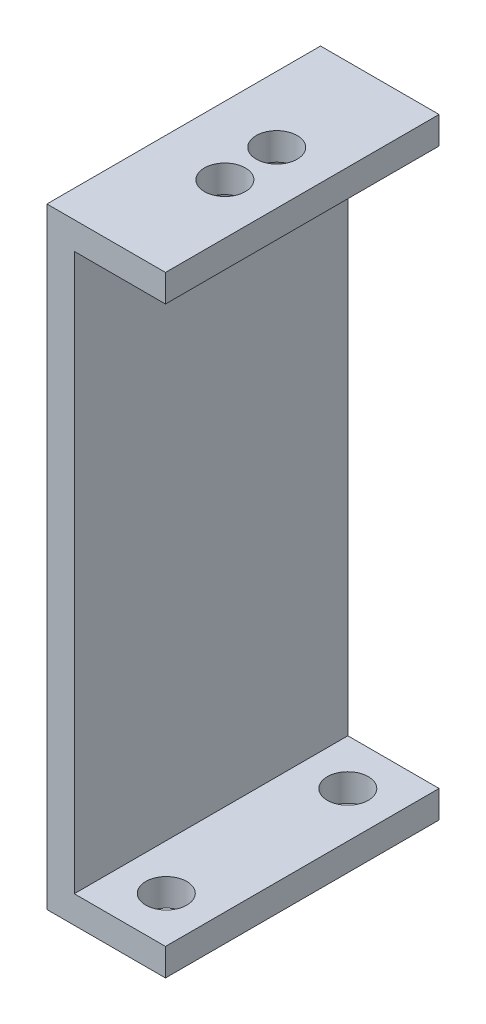
ISO-10303-21;
HEADER;
FILE_DESCRIPTION(('STEP AP214'),'2;1');
FILE_NAME('part.step','',(''),(''),'','','');
FILE_SCHEMA(('AUTOMOTIVE_DESIGN { 1 0 10303 214 1 1 1 1 }'));
ENDSEC;
DATA;
#1=APPLICATION_CONTEXT('core data for automotive mechanical design processes');
#2=APPLICATION_PROTOCOL_DEFINITION('international standard','automotive_design',2000,#1);
#3=PRODUCT_CONTEXT('',#1,'mechanical');
#4=PRODUCT('Part','Part','',(#3));
#5=PRODUCT_RELATED_PRODUCT_CATEGORY('part','',(#4));
#6=PRODUCT_DEFINITION_FORMATION('','',#4);
#7=PRODUCT_DEFINITION_CONTEXT('part definition',#1,'design');
#8=PRODUCT_DEFINITION('design','',#6,#7);
#9=PRODUCT_DEFINITION_SHAPE('','',#8);
#10=(LENGTH_UNIT() NAMED_UNIT(*) SI_UNIT(.MILLI.,.METRE.));
#11=(NAMED_UNIT(*) PLANE_ANGLE_UNIT() SI_UNIT($,.RADIAN.));
#12=(NAMED_UNIT(*) SI_UNIT($,.STERADIAN.) SOLID_ANGLE_UNIT());
#13=UNCERTAINTY_MEASURE_WITH_UNIT(LENGTH_MEASURE(1.E-05),#10,'distance_accuracy_value','');
#14=(GEOMETRIC_REPRESENTATION_CONTEXT(3) GLOBAL_UNCERTAINTY_ASSIGNED_CONTEXT((#13)) GLOBAL_UNIT_ASSIGNED_CONTEXT((#10,
#11,#12)) REPRESENTATION_CONTEXT('',''));
#15=CARTESIAN_POINT('',(0.,0.,0.));
#16=DIRECTION('',(0.,0.,1.));
#17=DIRECTION('',(1.,0.,0.));
#18=AXIS2_PLACEMENT_3D('',#15,#16,#17);
#19=CARTESIAN_POINT('',(6.5,-33.5,30.));
#20=DIRECTION('',(-1.,0.,0.));
#21=DIRECTION('',(0.,0.,1.));
#22=AXIS2_PLACEMENT_3D('',#19,#20,#21);
#23=PLANE('',#22);
#24=DIRECTION('',(0.,1.,0.));
#25=VECTOR('',#24,1.);
#26=CARTESIAN_POINT('',(6.5,-33.5,0.));
#27=LINE('',#26,#25);
#28=CARTESIAN_POINT('',(6.5,-33.5,0.));
#29=VERTEX_POINT('',#28);
#30=CARTESIAN_POINT('',(6.5,-30.5,0.));
#31=VERTEX_POINT('',#30);
#32=EDGE_CURVE('E120',#29,#31,#27,.T.);
#33=ORIENTED_EDGE('',*,*,#32,.T.);
#34=DIRECTION('',(0.,0.,-1.));
#35=VECTOR('',#34,1.);
#36=CARTESIAN_POINT('',(6.5,-30.5,45.3512882876339));
#37=LINE('',#36,#35);
#38=CARTESIAN_POINT('',(6.5,-30.5,30.));
#39=VERTEX_POINT('',#38);
#40=EDGE_CURVE('E109',#39,#31,#37,.T.);
#41=ORIENTED_EDGE('',*,*,#40,.F.);
#42=DIRECTION('',(0.,1.,0.));
#43=VECTOR('',#42,1.);
#44=CARTESIAN_POINT('',(6.5,-33.5,30.));
#45=LINE('',#44,#43);
#46=CARTESIAN_POINT('',(6.5,-33.5,30.));
#47=VERTEX_POINT('',#46);
#48=EDGE_CURVE('E118',#47,#39,#45,.T.);
#49=ORIENTED_EDGE('',*,*,#48,.F.);
#50=DIRECTION('',(0.,0.,-1.));
#51=VECTOR('',#50,1.);
#52=CARTESIAN_POINT('',(6.5,-33.5,30.));
#53=LINE('',#52,#51);
#54=EDGE_CURVE('E133',#47,#29,#53,.T.);
#55=ORIENTED_EDGE('',*,*,#54,.T.);
#56=EDGE_LOOP('',(#33,#41,#49,#55));
#57=FACE_BOUND('',#56,.T.);
#58=ADVANCED_FACE('F33',(#57),#23,.F.);
#59=CARTESIAN_POINT('',(6.5,30.5,30.));
#60=VERTEX_POINT('',#59);
#61=CARTESIAN_POINT('',(6.5,33.5,30.));
#62=VERTEX_POINT('',#61);
#63=EDGE_CURVE('E84',#60,#62,#45,.T.);
#64=ORIENTED_EDGE('',*,*,#63,.F.);
#65=DIRECTION('',(0.,0.,1.));
#66=VECTOR('',#65,1.);
#67=CARTESIAN_POINT('',(6.5,30.5,-22.1051576879177));
#68=LINE('',#67,#66);
#69=CARTESIAN_POINT('',(6.5,30.5,0.));
#70=VERTEX_POINT('',#69);
#71=EDGE_CURVE('E121',#70,#60,#68,.T.);
#72=ORIENTED_EDGE('',*,*,#71,.F.);
#73=CARTESIAN_POINT('',(6.5,33.5,0.));
#74=VERTEX_POINT('',#73);
#75=EDGE_CURVE('E112',#70,#74,#27,.T.);
#76=ORIENTED_EDGE('',*,*,#75,.T.);
#77=DIRECTION('',(0.,0.,-1.));
#78=VECTOR('',#77,1.);
#79=CARTESIAN_POINT('',(6.5,33.5,30.));
#80=LINE('',#79,#78);
#81=EDGE_CURVE('E146',#62,#74,#80,.T.);
#82=ORIENTED_EDGE('',*,*,#81,.F.);
#83=EDGE_LOOP('',(#64,#72,#76,#82));
#84=FACE_BOUND('',#83,.T.);
#85=ADVANCED_FACE('F35',(#84),#23,.F.);
#86=CARTESIAN_POINT('',(-6.5,33.5,30.));
#87=DIRECTION('',(0.,-1.,0.));
#88=DIRECTION('',(0.,0.,-1.));
#89=AXIS2_PLACEMENT_3D('',#86,#87,#88);
#90=PLANE('',#89);
#91=CARTESIAN_POINT('',(0.958202428755328,33.5,17.9446950770199));
#92=DIRECTION('',(0.,1.,0.));
#93=DIRECTION('',(0.,0.,1.));
#94=AXIS2_PLACEMENT_3D('',#91,#92,#93);
#95=CIRCLE('',#94,2.24999999999999);
#96=CARTESIAN_POINT('',(0.958202428755328,33.5,20.1946950770199));
#97=VERTEX_POINT('',#96);
#98=EDGE_CURVE('E200',#97,#97,#95,.T.);
#99=ORIENTED_EDGE('',*,*,#98,.F.);
#100=EDGE_LOOP('',(#99));
#101=FACE_BOUND('',#100,.T.);
#102=CARTESIAN_POINT('',(0.724225784551891,33.5,12.0242730008044));
#103=DIRECTION('',(0.,1.,0.));
#104=DIRECTION('',(0.,0.,1.));
#105=AXIS2_PLACEMENT_3D('',#102,#103,#104);
#106=CIRCLE('',#105,2.25);
#107=CARTESIAN_POINT('',(0.724225784551891,33.5,14.2742730008044));
#108=VERTEX_POINT('',#107);
#109=EDGE_CURVE('E182',#108,#108,#106,.T.);
#110=ORIENTED_EDGE('',*,*,#109,.F.);
#111=EDGE_LOOP('',(#110));
#112=FACE_BOUND('',#111,.T.);
#113=DIRECTION('',(-1.,0.,0.));
#114=VECTOR('',#113,1.);
#115=CARTESIAN_POINT('',(-6.5,33.5,0.));
#116=LINE('',#115,#114);
#117=CARTESIAN_POINT('',(-6.5,33.5,0.));
#118=VERTEX_POINT('',#117);
#119=EDGE_CURVE('E135',#74,#118,#116,.T.);
#120=ORIENTED_EDGE('',*,*,#119,.T.);
#121=DIRECTION('',(0.,0.,-1.));
#122=VECTOR('',#121,1.);
#123=CARTESIAN_POINT('',(-6.5,33.5,30.));
#124=LINE('',#123,#122);
#125=CARTESIAN_POINT('',(-6.5,33.5,30.));
#126=VERTEX_POINT('',#125);
#127=EDGE_CURVE('E143',#126,#118,#124,.T.);
#128=ORIENTED_EDGE('',*,*,#127,.F.);
#129=DIRECTION('',(-1.,0.,0.));
#130=VECTOR('',#129,1.);
#131=CARTESIAN_POINT('',(-6.5,33.5,30.));
#132=LINE('',#131,#130);
#133=EDGE_CURVE('E125',#62,#126,#132,.T.);
#134=ORIENTED_EDGE('',*,*,#133,.F.);
#135=ORIENTED_EDGE('',*,*,#81,.T.);
#136=EDGE_LOOP('',(#120,#128,#134,#135));
#137=FACE_BOUND('',#136,.T.);
#138=ADVANCED_FACE('F168',(#101,#112,#137),#90,.F.);
#139=CARTESIAN_POINT('',(-6.5,-33.5,30.));
#140=DIRECTION('',(1.,0.,0.));
#141=DIRECTION('',(0.,0.,-1.));
#142=AXIS2_PLACEMENT_3D('',#139,#140,#141);
#143=PLANE('',#142);
#144=DIRECTION('',(0.,-1.,0.));
#145=VECTOR('',#144,1.);
#146=CARTESIAN_POINT('',(-6.5,-33.5,0.));
#147=LINE('',#146,#145);
#148=CARTESIAN_POINT('',(-6.5,-33.5,0.));
#149=VERTEX_POINT('',#148);
#150=EDGE_CURVE('E137',#118,#149,#147,.T.);
#151=ORIENTED_EDGE('',*,*,#150,.T.);
#152=DIRECTION('',(0.,0.,-1.));
#153=VECTOR('',#152,1.);
#154=CARTESIAN_POINT('',(-6.5,-33.5,30.));
#155=LINE('',#154,#153);
#156=CARTESIAN_POINT('',(-6.5,-33.5,30.));
#157=VERTEX_POINT('',#156);
#158=EDGE_CURVE('E141',#157,#149,#155,.T.);
#159=ORIENTED_EDGE('',*,*,#158,.F.);
#160=DIRECTION('',(0.,-1.,0.));
#161=VECTOR('',#160,1.);
#162=CARTESIAN_POINT('',(-6.5,-33.5,30.));
#163=LINE('',#162,#161);
#164=EDGE_CURVE('E127',#126,#157,#163,.T.);
#165=ORIENTED_EDGE('',*,*,#164,.F.);
#166=ORIENTED_EDGE('',*,*,#127,.T.);
#167=EDGE_LOOP('',(#151,#159,#165,#166));
#168=FACE_BOUND('',#167,.T.);
#169=ADVANCED_FACE('F172',(#168),#143,.F.);
#170=CARTESIAN_POINT('',(-6.5,-33.5,30.));
#171=DIRECTION('',(0.,1.,0.));
#172=DIRECTION('',(0.,0.,1.));
#173=AXIS2_PLACEMENT_3D('',#170,#171,#172);
#174=PLANE('',#173);
#175=CARTESIAN_POINT('',(1.5,-33.5,5.00801519830674));
#176=DIRECTION('',(0.,1.,0.));
#177=DIRECTION('',(0.,0.,1.));
#178=AXIS2_PLACEMENT_3D('',#175,#176,#177);
#179=CIRCLE('',#178,2.25);
#180=CARTESIAN_POINT('',(1.5,-33.5,7.25801519830673));
#181=VERTEX_POINT('',#180);
#182=EDGE_CURVE('E191',#181,#181,#179,.T.);
#183=ORIENTED_EDGE('',*,*,#182,.T.);
#184=EDGE_LOOP('',(#183));
#185=FACE_BOUND('',#184,.T.);
#186=CARTESIAN_POINT('',(1.5,-33.5,24.9106646779449));
#187=DIRECTION('',(0.,1.,0.));
#188=DIRECTION('',(0.,0.,1.));
#189=AXIS2_PLACEMENT_3D('',#186,#187,#188);
#190=CIRCLE('',#189,2.25);
#191=CARTESIAN_POINT('',(1.5,-33.5,27.1606646779449));
#192=VERTEX_POINT('',#191);
#193=EDGE_CURVE('E185',#192,#192,#190,.T.);
#194=ORIENTED_EDGE('',*,*,#193,.T.);
#195=EDGE_LOOP('',(#194));
#196=FACE_BOUND('',#195,.T.);
#197=DIRECTION('',(1.,0.,0.));
#198=VECTOR('',#197,1.);
#199=CARTESIAN_POINT('',(-6.5,-33.5,0.));
#200=LINE('',#199,#198);
#201=EDGE_CURVE('E77',#149,#29,#200,.T.);
#202=ORIENTED_EDGE('',*,*,#201,.T.);
#203=ORIENTED_EDGE('',*,*,#54,.F.);
#204=DIRECTION('',(1.,0.,0.));
#205=VECTOR('',#204,1.);
#206=CARTESIAN_POINT('',(-6.5,-33.5,30.));
#207=LINE('',#206,#205);
#208=EDGE_CURVE('E56',#157,#47,#207,.T.);
#209=ORIENTED_EDGE('',*,*,#208,.F.);
#210=ORIENTED_EDGE('',*,*,#158,.T.);
#211=EDGE_LOOP('',(#202,#203,#209,#210));
#212=FACE_BOUND('',#211,.T.);
#213=ADVANCED_FACE('F173',(#185,#196,#212),#174,.F.);
#214=CARTESIAN_POINT('',(0.,0.,30.));
#215=DIRECTION('',(0.,0.,-1.));
#216=DIRECTION('',(-1.,0.,0.));
#217=AXIS2_PLACEMENT_3D('',#214,#215,#216);
#218=PLANE('',#217);
#219=ORIENTED_EDGE('',*,*,#48,.T.);
#220=DIRECTION('',(-1.,0.,0.));
#221=VECTOR('',#220,1.);
#222=CARTESIAN_POINT('',(0.,-30.5,30.));
#223=LINE('',#222,#221);
#224=CARTESIAN_POINT('',(-3.5,-30.5,30.));
#225=VERTEX_POINT('',#224);
#226=EDGE_CURVE('E106',#39,#225,#223,.T.);
#227=ORIENTED_EDGE('',*,*,#226,.T.);
#228=DIRECTION('',(0.,-1.,0.));
#229=VECTOR('',#228,1.);
#230=CARTESIAN_POINT('',(-3.5,0.,30.));
#231=LINE('',#230,#229);
#232=CARTESIAN_POINT('',(-3.5,30.5,30.));
#233=VERTEX_POINT('',#232);
#234=EDGE_CURVE('E175',#233,#225,#231,.T.);
#235=ORIENTED_EDGE('',*,*,#234,.F.);
#236=DIRECTION('',(1.,0.,0.));
#237=VECTOR('',#236,1.);
#238=CARTESIAN_POINT('',(0.,30.5,30.));
#239=LINE('',#238,#237);
#240=EDGE_CURVE('E113',#233,#60,#239,.T.);
#241=ORIENTED_EDGE('',*,*,#240,.T.);
#242=ORIENTED_EDGE('',*,*,#63,.T.);
#243=ORIENTED_EDGE('',*,*,#133,.T.);
#244=ORIENTED_EDGE('',*,*,#164,.T.);
#245=ORIENTED_EDGE('',*,*,#208,.T.);
#246=EDGE_LOOP('',(#219,#227,#235,#241,#242,#243,#244,#245));
#247=FACE_BOUND('',#246,.T.);
#248=ADVANCED_FACE('F124',(#247),#218,.F.);
#249=CARTESIAN_POINT('',(0.,0.,0.));
#250=DIRECTION('',(0.,0.,-1.));
#251=DIRECTION('',(-1.,0.,0.));
#252=AXIS2_PLACEMENT_3D('',#249,#250,#251);
#253=PLANE('',#252);
#254=DIRECTION('',(-1.,0.,0.));
#255=VECTOR('',#254,1.);
#256=CARTESIAN_POINT('',(0.,-30.5,0.));
#257=LINE('',#256,#255);
#258=CARTESIAN_POINT('',(-3.5,-30.5,0.));
#259=VERTEX_POINT('',#258);
#260=EDGE_CURVE('E11',#31,#259,#257,.T.);
#261=ORIENTED_EDGE('',*,*,#260,.F.);
#262=ORIENTED_EDGE('',*,*,#32,.F.);
#263=ORIENTED_EDGE('',*,*,#201,.F.);
#264=ORIENTED_EDGE('',*,*,#150,.F.);
#265=ORIENTED_EDGE('',*,*,#119,.F.);
#266=ORIENTED_EDGE('',*,*,#75,.F.);
#267=DIRECTION('',(1.,0.,0.));
#268=VECTOR('',#267,1.);
#269=CARTESIAN_POINT('',(0.,30.5,0.));
#270=LINE('',#269,#268);
#271=CARTESIAN_POINT('',(-3.5,30.5,0.));
#272=VERTEX_POINT('',#271);
#273=EDGE_CURVE('E41',#272,#70,#270,.T.);
#274=ORIENTED_EDGE('',*,*,#273,.F.);
#275=DIRECTION('',(0.,-1.,0.));
#276=VECTOR('',#275,1.);
#277=CARTESIAN_POINT('',(-3.5,0.,0.));
#278=LINE('',#277,#276);
#279=EDGE_CURVE('E149',#272,#259,#278,.T.);
#280=ORIENTED_EDGE('',*,*,#279,.T.);
#281=EDGE_LOOP('',(#261,#262,#263,#264,#265,#266,#274,#280));
#282=FACE_BOUND('',#281,.T.);
#283=ADVANCED_FACE('F164',(#282),#253,.T.);
#284=CARTESIAN_POINT('',(-3.5,-30.5,45.3512882876339));
#285=DIRECTION('',(0.,-1.,0.));
#286=DIRECTION('',(0.,0.,-1.));
#287=AXIS2_PLACEMENT_3D('',#284,#285,#286);
#288=PLANE('',#287);
#289=CARTESIAN_POINT('',(1.5,-30.5,5.00801519830674));
#290=DIRECTION('',(0.,1.,0.));
#291=DIRECTION('',(0.,0.,1.));
#292=AXIS2_PLACEMENT_3D('',#289,#290,#291);
#293=CIRCLE('',#292,2.25);
#294=CARTESIAN_POINT('',(1.5,-30.5,7.25801519830674));
#295=VERTEX_POINT('',#294);
#296=EDGE_CURVE('E194',#295,#295,#293,.T.);
#297=ORIENTED_EDGE('',*,*,#296,.F.);
#298=EDGE_LOOP('',(#297));
#299=FACE_BOUND('',#298,.T.);
#300=CARTESIAN_POINT('',(1.5,-30.5,24.9106646779449));
#301=DIRECTION('',(0.,1.,0.));
#302=DIRECTION('',(0.,0.,1.));
#303=AXIS2_PLACEMENT_3D('',#300,#301,#302);
#304=CIRCLE('',#303,2.25);
#305=CARTESIAN_POINT('',(1.5,-30.5,27.1606646779449));
#306=VERTEX_POINT('',#305);
#307=EDGE_CURVE('E188',#306,#306,#304,.T.);
#308=ORIENTED_EDGE('',*,*,#307,.F.);
#309=EDGE_LOOP('',(#308));
#310=FACE_BOUND('',#309,.T.);
#311=ORIENTED_EDGE('',*,*,#40,.T.);
#312=ORIENTED_EDGE('',*,*,#260,.T.);
#313=DIRECTION('',(0.,0.,-1.));
#314=VECTOR('',#313,1.);
#315=CARTESIAN_POINT('',(-3.5,-30.5,45.3512882876339));
#316=LINE('',#315,#314);
#317=EDGE_CURVE('E48',#225,#259,#316,.T.);
#318=ORIENTED_EDGE('',*,*,#317,.F.);
#319=ORIENTED_EDGE('',*,*,#226,.F.);
#320=EDGE_LOOP('',(#311,#312,#318,#319));
#321=FACE_BOUND('',#320,.T.);
#322=ADVANCED_FACE('F108',(#299,#310,#321),#288,.F.);
#323=CARTESIAN_POINT('',(-3.5,30.5,-22.1051576879177));
#324=DIRECTION('',(0.,1.,0.));
#325=DIRECTION('',(0.,0.,1.));
#326=AXIS2_PLACEMENT_3D('',#323,#324,#325);
#327=PLANE('',#326);
#328=CARTESIAN_POINT('',(0.958202428755328,30.5,17.9446950770199));
#329=DIRECTION('',(0.,1.,0.));
#330=DIRECTION('',(0.,0.,1.));
#331=AXIS2_PLACEMENT_3D('',#328,#329,#330);
#332=CIRCLE('',#331,2.24999999999999);
#333=CARTESIAN_POINT('',(0.958202428755328,30.5,20.1946950770199));
#334=VERTEX_POINT('',#333);
#335=EDGE_CURVE('E197',#334,#334,#332,.T.);
#336=ORIENTED_EDGE('',*,*,#335,.T.);
#337=EDGE_LOOP('',(#336));
#338=FACE_BOUND('',#337,.T.);
#339=CARTESIAN_POINT('',(0.724225784551891,30.5,12.0242730008044));
#340=DIRECTION('',(0.,1.,0.));
#341=DIRECTION('',(0.,0.,1.));
#342=AXIS2_PLACEMENT_3D('',#339,#340,#341);
#343=CIRCLE('',#342,2.25);
#344=CARTESIAN_POINT('',(0.724225784551891,30.5,14.2742730008044));
#345=VERTEX_POINT('',#344);
#346=EDGE_CURVE('E122',#345,#345,#343,.T.);
#347=ORIENTED_EDGE('',*,*,#346,.T.);
#348=EDGE_LOOP('',(#347));
#349=FACE_BOUND('',#348,.T.);
#350=DIRECTION('',(0.,0.,1.));
#351=VECTOR('',#350,1.);
#352=CARTESIAN_POINT('',(-3.5,30.5,-22.1051576879177));
#353=LINE('',#352,#351);
#354=EDGE_CURVE('E157',#272,#233,#353,.T.);
#355=ORIENTED_EDGE('',*,*,#354,.F.);
#356=ORIENTED_EDGE('',*,*,#273,.T.);
#357=ORIENTED_EDGE('',*,*,#71,.T.);
#358=ORIENTED_EDGE('',*,*,#240,.F.);
#359=EDGE_LOOP('',(#355,#356,#357,#358));
#360=FACE_BOUND('',#359,.T.);
#361=ADVANCED_FACE('F155',(#338,#349,#360),#327,.F.);
#362=CARTESIAN_POINT('',(-3.5,0.,0.));
#363=DIRECTION('',(1.,0.,0.));
#364=DIRECTION('',(0.,0.,-1.));
#365=AXIS2_PLACEMENT_3D('',#362,#363,#364);
#366=PLANE('',#365);
#367=ORIENTED_EDGE('',*,*,#234,.T.);
#368=ORIENTED_EDGE('',*,*,#317,.T.);
#369=ORIENTED_EDGE('',*,*,#279,.F.);
#370=ORIENTED_EDGE('',*,*,#354,.T.);
#371=EDGE_LOOP('',(#367,#368,#369,#370));
#372=FACE_BOUND('',#371,.T.);
#373=ADVANCED_FACE('F174',(#372),#366,.T.);
#374=CARTESIAN_POINT('',(0.724225784551891,33.5,12.0242730008044));
#375=DIRECTION('',(0.,1.,0.));
#376=DIRECTION('',(0.,0.,1.));
#377=AXIS2_PLACEMENT_3D('',#374,#375,#376);
#378=CYLINDRICAL_SURFACE('',#377,2.25);
#379=ORIENTED_EDGE('',*,*,#109,.T.);
#380=EDGE_LOOP('',(#379));
#381=FACE_BOUND('',#380,.T.);
#382=ORIENTED_EDGE('',*,*,#346,.F.);
#383=EDGE_LOOP('',(#382));
#384=FACE_BOUND('',#383,.T.);
#385=ADVANCED_FACE('F211',(#381,#384),#378,.F.);
#386=CARTESIAN_POINT('',(1.5,-30.5,24.9106646779449));
#387=DIRECTION('',(0.,1.,0.));
#388=DIRECTION('',(0.,0.,1.));
#389=AXIS2_PLACEMENT_3D('',#386,#387,#388);
#390=CYLINDRICAL_SURFACE('',#389,2.25);
#391=ORIENTED_EDGE('',*,*,#307,.T.);
#392=EDGE_LOOP('',(#391));
#393=FACE_BOUND('',#392,.T.);
#394=ORIENTED_EDGE('',*,*,#193,.F.);
#395=EDGE_LOOP('',(#394));
#396=FACE_BOUND('',#395,.T.);
#397=ADVANCED_FACE('F214',(#393,#396),#390,.F.);
#398=CARTESIAN_POINT('',(1.5,-30.5,5.00801519830674));
#399=DIRECTION('',(0.,1.,0.));
#400=DIRECTION('',(0.,0.,1.));
#401=AXIS2_PLACEMENT_3D('',#398,#399,#400);
#402=CYLINDRICAL_SURFACE('',#401,2.25);
#403=ORIENTED_EDGE('',*,*,#296,.T.);
#404=EDGE_LOOP('',(#403));
#405=FACE_BOUND('',#404,.T.);
#406=ORIENTED_EDGE('',*,*,#182,.F.);
#407=EDGE_LOOP('',(#406));
#408=FACE_BOUND('',#407,.T.);
#409=ADVANCED_FACE('F294',(#405,#408),#402,.F.);
#410=CARTESIAN_POINT('',(0.958202428755328,33.5,17.9446950770199));
#411=DIRECTION('',(0.,1.,0.));
#412=DIRECTION('',(0.,0.,1.));
#413=AXIS2_PLACEMENT_3D('',#410,#411,#412);
#414=CYLINDRICAL_SURFACE('',#413,2.24999999999999);
#415=ORIENTED_EDGE('',*,*,#98,.T.);
#416=EDGE_LOOP('',(#415));
#417=FACE_BOUND('',#416,.T.);
#418=ORIENTED_EDGE('',*,*,#335,.F.);
#419=EDGE_LOOP('',(#418));
#420=FACE_BOUND('',#419,.T.);
#421=ADVANCED_FACE('F204',(#417,#420),#414,.F.);
#422=CLOSED_SHELL('',(#58,#85,#138,#169,#213,#248,#283,#322,#361,#373,#385,#397,#409,#421));
#423=MANIFOLD_SOLID_BREP('B2',#422);
#424=ADVANCED_BREP_SHAPE_REPRESENTATION('',(#18,#423),#14);
#425=SHAPE_DEFINITION_REPRESENTATION(#9,#424);
ENDSEC;
END-ISO-10303-21;
